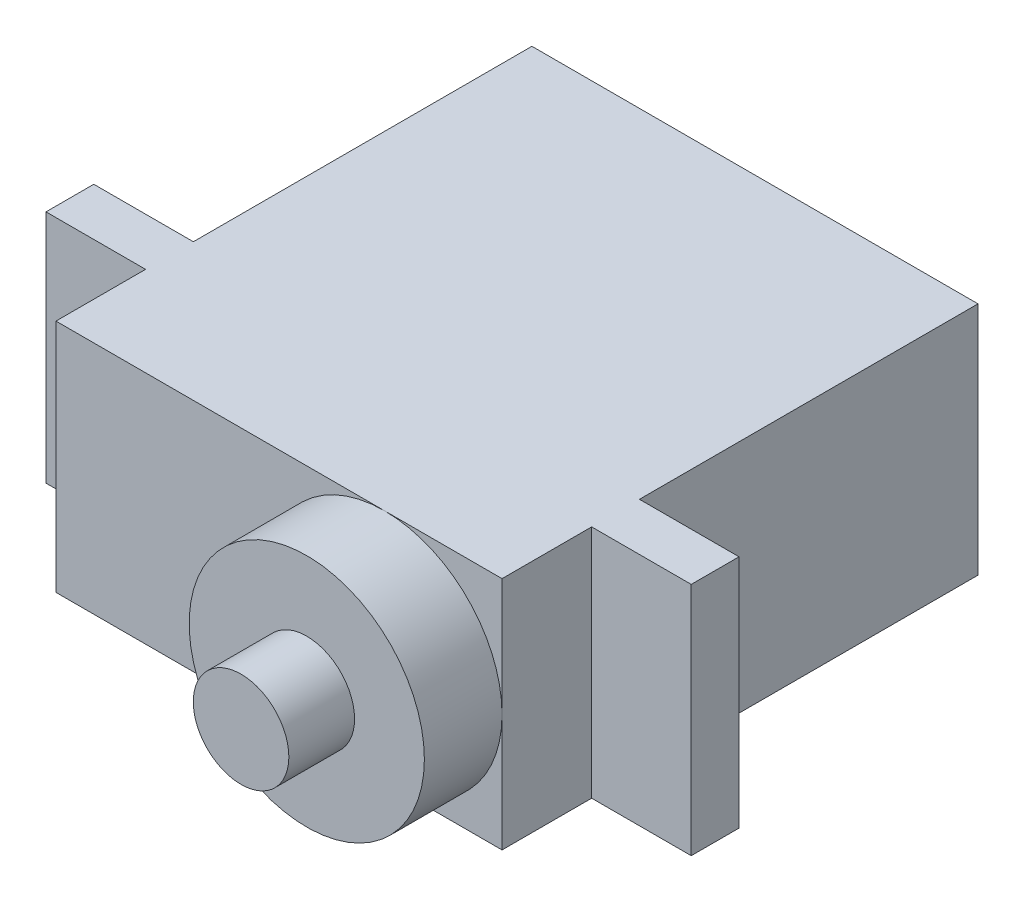
ISO-10303-21;
HEADER;
FILE_DESCRIPTION(('STEP AP214'),'2;1');
FILE_NAME('part.step','',(''),(''),'','','');
FILE_SCHEMA(('AUTOMOTIVE_DESIGN { 1 0 10303 214 1 1 1 1 }'));
ENDSEC;
DATA;
#1=APPLICATION_CONTEXT('core data for automotive mechanical design processes');
#2=APPLICATION_PROTOCOL_DEFINITION('international standard','automotive_design',2000,#1);
#3=PRODUCT_CONTEXT('',#1,'mechanical');
#4=PRODUCT('Part','Part','',(#3));
#5=PRODUCT_RELATED_PRODUCT_CATEGORY('part','',(#4));
#6=PRODUCT_DEFINITION_FORMATION('','',#4);
#7=PRODUCT_DEFINITION_CONTEXT('part definition',#1,'design');
#8=PRODUCT_DEFINITION('design','',#6,#7);
#9=PRODUCT_DEFINITION_SHAPE('','',#8);
#10=(LENGTH_UNIT() NAMED_UNIT(*) SI_UNIT(.MILLI.,.METRE.));
#11=(NAMED_UNIT(*) PLANE_ANGLE_UNIT() SI_UNIT($,.RADIAN.));
#12=(NAMED_UNIT(*) SI_UNIT($,.STERADIAN.) SOLID_ANGLE_UNIT());
#13=UNCERTAINTY_MEASURE_WITH_UNIT(LENGTH_MEASURE(1.E-05),#10,'distance_accuracy_value','');
#14=(GEOMETRIC_REPRESENTATION_CONTEXT(3) GLOBAL_UNCERTAINTY_ASSIGNED_CONTEXT((#13)) GLOBAL_UNIT_ASSIGNED_CONTEXT((#10,
#11,#12)) REPRESENTATION_CONTEXT('',''));
#15=CARTESIAN_POINT('',(0.,0.,0.));
#16=DIRECTION('',(0.,0.,1.));
#17=DIRECTION('',(1.,0.,0.));
#18=AXIS2_PLACEMENT_3D('',#15,#16,#17);
#19=CARTESIAN_POINT('',(0.,0.,0.));
#20=DIRECTION('',(0.,0.,1.));
#21=DIRECTION('',(1.,0.,0.));
#22=AXIS2_PLACEMENT_3D('',#19,#20,#21);
#23=PLANE('',#22);
#24=DIRECTION('',(0.,1.,0.));
#25=VECTOR('',#24,1.);
#26=CARTESIAN_POINT('',(-11.2,5.9,0.));
#27=LINE('',#26,#25);
#28=CARTESIAN_POINT('',(-11.2,-5.9,0.));
#29=VERTEX_POINT('',#28);
#30=CARTESIAN_POINT('',(-11.2,5.9,0.));
#31=VERTEX_POINT('',#30);
#32=EDGE_CURVE('E173',#29,#31,#27,.T.);
#33=ORIENTED_EDGE('',*,*,#32,.F.);
#34=DIRECTION('',(1.,0.,0.));
#35=VECTOR('',#34,1.);
#36=CARTESIAN_POINT('',(16.2,-5.9,0.));
#37=LINE('',#36,#35);
#38=CARTESIAN_POINT('',(-16.2,-5.9,0.));
#39=VERTEX_POINT('',#38);
#40=EDGE_CURVE('E254',#39,#29,#37,.T.);
#41=ORIENTED_EDGE('',*,*,#40,.F.);
#42=DIRECTION('',(0.,-1.,0.));
#43=VECTOR('',#42,1.);
#44=CARTESIAN_POINT('',(-16.2,5.9,0.));
#45=LINE('',#44,#43);
#46=CARTESIAN_POINT('',(-16.2,5.9,0.));
#47=VERTEX_POINT('',#46);
#48=EDGE_CURVE('E264',#47,#39,#45,.T.);
#49=ORIENTED_EDGE('',*,*,#48,.F.);
#50=DIRECTION('',(-1.,0.,0.));
#51=VECTOR('',#50,1.);
#52=CARTESIAN_POINT('',(16.2,5.9,0.));
#53=LINE('',#52,#51);
#54=EDGE_CURVE('E63',#31,#47,#53,.T.);
#55=ORIENTED_EDGE('',*,*,#54,.F.);
#56=EDGE_LOOP('',(#33,#41,#49,#55));
#57=FACE_BOUND('',#56,.T.);
#58=ADVANCED_FACE('F45',(#57),#23,.F.);
#59=DIRECTION('',(0.,-1.,0.));
#60=VECTOR('',#59,1.);
#61=CARTESIAN_POINT('',(11.2,5.9,0.));
#62=LINE('',#61,#60);
#63=CARTESIAN_POINT('',(11.2,5.9,0.));
#64=VERTEX_POINT('',#63);
#65=CARTESIAN_POINT('',(11.2,-5.9,0.));
#66=VERTEX_POINT('',#65);
#67=EDGE_CURVE('E71',#64,#66,#62,.T.);
#68=ORIENTED_EDGE('',*,*,#67,.F.);
#69=CARTESIAN_POINT('',(16.2,5.9,0.));
#70=VERTEX_POINT('',#69);
#71=EDGE_CURVE('E261',#70,#64,#53,.T.);
#72=ORIENTED_EDGE('',*,*,#71,.F.);
#73=DIRECTION('',(0.,1.,0.));
#74=VECTOR('',#73,1.);
#75=CARTESIAN_POINT('',(16.2,5.9,0.));
#76=LINE('',#75,#74);
#77=CARTESIAN_POINT('',(16.2,-5.9,0.));
#78=VERTEX_POINT('',#77);
#79=EDGE_CURVE('E258',#78,#70,#76,.T.);
#80=ORIENTED_EDGE('',*,*,#79,.F.);
#81=EDGE_CURVE('E238',#66,#78,#37,.T.);
#82=ORIENTED_EDGE('',*,*,#81,.F.);
#83=EDGE_LOOP('',(#68,#72,#80,#82));
#84=FACE_BOUND('',#83,.T.);
#85=ADVANCED_FACE('F337',(#84),#23,.F.);
#86=CARTESIAN_POINT('',(0.,0.,6.9));
#87=DIRECTION('',(0.,0.,1.));
#88=DIRECTION('',(1.,0.,0.));
#89=AXIS2_PLACEMENT_3D('',#86,#87,#88);
#90=PLANE('',#89);
#91=CARTESIAN_POINT('',(5.29476675188861,-0.00523556903391821,6.9));
#92=DIRECTION('',(0.,0.,1.));
#93=DIRECTION('',(1.,0.,0.));
#94=AXIS2_PLACEMENT_3D('',#91,#92,#93);
#95=CIRCLE('',#94,5.90523556903392);
#96=CARTESIAN_POINT('',(5.29476675188861,5.9,6.9));
#97=VERTEX_POINT('',#96);
#98=CARTESIAN_POINT('',(4.94325653980303,-5.9,6.9));
#99=VERTEX_POINT('',#98);
#100=EDGE_CURVE('E55',#97,#99,#95,.T.);
#101=ORIENTED_EDGE('',*,*,#100,.F.);
#102=DIRECTION('',(-1.,0.,0.));
#103=VECTOR('',#102,1.);
#104=CARTESIAN_POINT('',(-11.2,5.9,6.9));
#105=LINE('',#104,#103);
#106=CARTESIAN_POINT('',(-11.2,5.9,6.9));
#107=VERTEX_POINT('',#106);
#108=EDGE_CURVE('E211',#97,#107,#105,.T.);
#109=ORIENTED_EDGE('',*,*,#108,.T.);
#110=DIRECTION('',(0.,-1.,0.));
#111=VECTOR('',#110,1.);
#112=CARTESIAN_POINT('',(-11.2,5.9,6.9));
#113=LINE('',#112,#111);
#114=CARTESIAN_POINT('',(-11.2,-5.9,6.9));
#115=VERTEX_POINT('',#114);
#116=EDGE_CURVE('E196',#107,#115,#113,.T.);
#117=ORIENTED_EDGE('',*,*,#116,.T.);
#118=DIRECTION('',(1.,0.,0.));
#119=VECTOR('',#118,1.);
#120=CARTESIAN_POINT('',(-11.2,-5.9,6.9));
#121=LINE('',#120,#119);
#122=EDGE_CURVE('E202',#115,#99,#121,.T.);
#123=ORIENTED_EDGE('',*,*,#122,.T.);
#124=EDGE_LOOP('',(#101,#109,#117,#123));
#125=FACE_BOUND('',#124,.T.);
#126=ADVANCED_FACE('F335',(#125),#90,.T.);
#127=CARTESIAN_POINT('',(11.2000023209225,-0.00523556903391821,6.9));
#128=VERTEX_POINT('',#127);
#129=EDGE_CURVE('E191',#128,#97,#95,.T.);
#130=ORIENTED_EDGE('',*,*,#129,.F.);
#131=DIRECTION('',(0.,1.,0.));
#132=VECTOR('',#131,1.);
#133=CARTESIAN_POINT('',(11.2,5.9,6.9));
#134=LINE('',#133,#132);
#135=CARTESIAN_POINT('',(11.2,5.9,6.9));
#136=VERTEX_POINT('',#135);
#137=EDGE_CURVE('E206',#128,#136,#134,.T.);
#138=ORIENTED_EDGE('',*,*,#137,.T.);
#139=EDGE_CURVE('E212',#136,#97,#105,.T.);
#140=ORIENTED_EDGE('',*,*,#139,.T.);
#141=EDGE_LOOP('',(#130,#138,#140));
#142=FACE_BOUND('',#141,.T.);
#143=ADVANCED_FACE('F312',(#142),#90,.T.);
#144=CARTESIAN_POINT('',(0.,0.,2.4));
#145=DIRECTION('',(0.,0.,1.));
#146=DIRECTION('',(1.,0.,0.));
#147=AXIS2_PLACEMENT_3D('',#144,#145,#146);
#148=PLANE('',#147);
#149=DIRECTION('',(0.,-1.,0.));
#150=VECTOR('',#149,1.);
#151=CARTESIAN_POINT('',(-11.2,5.9,2.4));
#152=LINE('',#151,#150);
#153=CARTESIAN_POINT('',(-11.2,5.9,2.4));
#154=VERTEX_POINT('',#153);
#155=CARTESIAN_POINT('',(-11.2,-5.9,2.4));
#156=VERTEX_POINT('',#155);
#157=EDGE_CURVE('E190',#154,#156,#152,.T.);
#158=ORIENTED_EDGE('',*,*,#157,.F.);
#159=DIRECTION('',(-1.,0.,0.));
#160=VECTOR('',#159,1.);
#161=CARTESIAN_POINT('',(16.2,5.9,2.4));
#162=LINE('',#161,#160);
#163=CARTESIAN_POINT('',(-16.2,5.9,2.4));
#164=VERTEX_POINT('',#163);
#165=EDGE_CURVE('E246',#154,#164,#162,.T.);
#166=ORIENTED_EDGE('',*,*,#165,.T.);
#167=DIRECTION('',(0.,-1.,0.));
#168=VECTOR('',#167,1.);
#169=CARTESIAN_POINT('',(-16.2,5.9,2.4));
#170=LINE('',#169,#168);
#171=CARTESIAN_POINT('',(-16.2,-5.9,2.4));
#172=VERTEX_POINT('',#171);
#173=EDGE_CURVE('E250',#164,#172,#170,.T.);
#174=ORIENTED_EDGE('',*,*,#173,.T.);
#175=DIRECTION('',(1.,0.,0.));
#176=VECTOR('',#175,1.);
#177=CARTESIAN_POINT('',(16.2,-5.9,2.4));
#178=LINE('',#177,#176);
#179=EDGE_CURVE('E239',#172,#156,#178,.T.);
#180=ORIENTED_EDGE('',*,*,#179,.T.);
#181=EDGE_LOOP('',(#158,#166,#174,#180));
#182=FACE_BOUND('',#181,.T.);
#183=ADVANCED_FACE('F325',(#182),#148,.T.);
#184=CARTESIAN_POINT('',(16.2,-5.9,2.4));
#185=DIRECTION('',(0.,1.,0.));
#186=DIRECTION('',(0.,0.,1.));
#187=AXIS2_PLACEMENT_3D('',#184,#185,#186);
#188=PLANE('',#187);
#189=ORIENTED_EDGE('',*,*,#40,.T.);
#190=DIRECTION('',(0.,0.,1.));
#191=VECTOR('',#190,1.);
#192=CARTESIAN_POINT('',(-11.2,-5.9,-17.));
#193=LINE('',#192,#191);
#194=CARTESIAN_POINT('',(-11.2,-5.9,-17.));
#195=VERTEX_POINT('',#194);
#196=EDGE_CURVE('E372',#195,#29,#193,.T.);
#197=ORIENTED_EDGE('',*,*,#196,.F.);
#198=DIRECTION('',(-1.,0.,0.));
#199=VECTOR('',#198,1.);
#200=CARTESIAN_POINT('',(-11.2,-5.9,-17.));
#201=LINE('',#200,#199);
#202=CARTESIAN_POINT('',(11.2,-5.9,-17.));
#203=VERTEX_POINT('',#202);
#204=EDGE_CURVE('E166',#203,#195,#201,.T.);
#205=ORIENTED_EDGE('',*,*,#204,.F.);
#206=DIRECTION('',(0.,0.,1.));
#207=VECTOR('',#206,1.);
#208=CARTESIAN_POINT('',(11.2,-5.9,-17.));
#209=LINE('',#208,#207);
#210=EDGE_CURVE('E182',#203,#66,#209,.T.);
#211=ORIENTED_EDGE('',*,*,#210,.T.);
#212=ORIENTED_EDGE('',*,*,#81,.T.);
#213=DIRECTION('',(0.,0.,-1.));
#214=VECTOR('',#213,1.);
#215=CARTESIAN_POINT('',(16.2,-5.9,2.4));
#216=LINE('',#215,#214);
#217=CARTESIAN_POINT('',(16.2,-5.9,2.4));
#218=VERTEX_POINT('',#217);
#219=EDGE_CURVE('E49',#218,#78,#216,.T.);
#220=ORIENTED_EDGE('',*,*,#219,.F.);
#221=CARTESIAN_POINT('',(11.2,-5.9,2.4));
#222=VERTEX_POINT('',#221);
#223=EDGE_CURVE('E243',#222,#218,#178,.T.);
#224=ORIENTED_EDGE('',*,*,#223,.F.);
#225=DIRECTION('',(0.,0.,-1.));
#226=VECTOR('',#225,1.);
#227=CARTESIAN_POINT('',(11.2,-5.9,6.9));
#228=LINE('',#227,#226);
#229=CARTESIAN_POINT('',(11.2,-5.9,6.9));
#230=VERTEX_POINT('',#229);
#231=EDGE_CURVE('E230',#230,#222,#228,.T.);
#232=ORIENTED_EDGE('',*,*,#231,.F.);
#233=CARTESIAN_POINT('',(5.6462769639742,-5.9,6.9));
#234=VERTEX_POINT('',#233);
#235=EDGE_CURVE('E200',#234,#230,#121,.T.);
#236=ORIENTED_EDGE('',*,*,#235,.F.);
#237=EDGE_CURVE('E207',#99,#234,#121,.T.);
#238=ORIENTED_EDGE('',*,*,#237,.F.);
#239=ORIENTED_EDGE('',*,*,#122,.F.);
#240=DIRECTION('',(0.,0.,-1.));
#241=VECTOR('',#240,1.);
#242=CARTESIAN_POINT('',(-11.2,-5.9,6.9));
#243=LINE('',#242,#241);
#244=EDGE_CURVE('E234',#115,#156,#243,.T.);
#245=ORIENTED_EDGE('',*,*,#244,.T.);
#246=ORIENTED_EDGE('',*,*,#179,.F.);
#247=DIRECTION('',(0.,0.,-1.));
#248=VECTOR('',#247,1.);
#249=CARTESIAN_POINT('',(-16.2,-5.9,2.4));
#250=LINE('',#249,#248);
#251=EDGE_CURVE('E253',#172,#39,#250,.T.);
#252=ORIENTED_EDGE('',*,*,#251,.T.);
#253=EDGE_LOOP('',(#189,#197,#205,#211,#212,#220,#224,#232,#236,#238,#239,#245,#246,#252));
#254=FACE_BOUND('',#253,.T.);
#255=ADVANCED_FACE('F47',(#254),#188,.F.);
#256=CARTESIAN_POINT('',(16.2,5.9,2.4));
#257=DIRECTION('',(-1.,0.,0.));
#258=DIRECTION('',(0.,0.,1.));
#259=AXIS2_PLACEMENT_3D('',#256,#257,#258);
#260=PLANE('',#259);
#261=ORIENTED_EDGE('',*,*,#79,.T.);
#262=DIRECTION('',(0.,0.,-1.));
#263=VECTOR('',#262,1.);
#264=CARTESIAN_POINT('',(16.2,5.9,2.4));
#265=LINE('',#264,#263);
#266=CARTESIAN_POINT('',(16.2,5.9,2.4));
#267=VERTEX_POINT('',#266);
#268=EDGE_CURVE('E273',#267,#70,#265,.T.);
#269=ORIENTED_EDGE('',*,*,#268,.F.);
#270=DIRECTION('',(0.,1.,0.));
#271=VECTOR('',#270,1.);
#272=CARTESIAN_POINT('',(16.2,5.9,2.4));
#273=LINE('',#272,#271);
#274=EDGE_CURVE('E242',#218,#267,#273,.T.);
#275=ORIENTED_EDGE('',*,*,#274,.F.);
#276=ORIENTED_EDGE('',*,*,#219,.T.);
#277=EDGE_LOOP('',(#261,#269,#275,#276));
#278=FACE_BOUND('',#277,.T.);
#279=ADVANCED_FACE('F359',(#278),#260,.F.);
#280=CARTESIAN_POINT('',(16.2,5.9,2.4));
#281=DIRECTION('',(0.,-1.,0.));
#282=DIRECTION('',(0.,0.,-1.));
#283=AXIS2_PLACEMENT_3D('',#280,#281,#282);
#284=PLANE('',#283);
#285=ORIENTED_EDGE('',*,*,#71,.T.);
#286=DIRECTION('',(0.,0.,1.));
#287=VECTOR('',#286,1.);
#288=CARTESIAN_POINT('',(11.2,5.9,-17.));
#289=LINE('',#288,#287);
#290=CARTESIAN_POINT('',(11.2,5.9,-17.));
#291=VERTEX_POINT('',#290);
#292=EDGE_CURVE('E156',#291,#64,#289,.T.);
#293=ORIENTED_EDGE('',*,*,#292,.F.);
#294=DIRECTION('',(1.,0.,0.));
#295=VECTOR('',#294,1.);
#296=CARTESIAN_POINT('',(-11.2,5.9,-17.));
#297=LINE('',#296,#295);
#298=CARTESIAN_POINT('',(-11.2,5.9,-17.));
#299=VERTEX_POINT('',#298);
#300=EDGE_CURVE('E149',#299,#291,#297,.T.);
#301=ORIENTED_EDGE('',*,*,#300,.F.);
#302=DIRECTION('',(0.,0.,1.));
#303=VECTOR('',#302,1.);
#304=CARTESIAN_POINT('',(-11.2,5.9,-17.));
#305=LINE('',#304,#303);
#306=EDGE_CURVE('E153',#299,#31,#305,.T.);
#307=ORIENTED_EDGE('',*,*,#306,.T.);
#308=ORIENTED_EDGE('',*,*,#54,.T.);
#309=DIRECTION('',(0.,0.,-1.));
#310=VECTOR('',#309,1.);
#311=CARTESIAN_POINT('',(-16.2,5.9,2.4));
#312=LINE('',#311,#310);
#313=EDGE_CURVE('E270',#164,#47,#312,.T.);
#314=ORIENTED_EDGE('',*,*,#313,.F.);
#315=ORIENTED_EDGE('',*,*,#165,.F.);
#316=DIRECTION('',(0.,0.,-1.));
#317=VECTOR('',#316,1.);
#318=CARTESIAN_POINT('',(-11.2,5.9,6.9));
#319=LINE('',#318,#317);
#320=EDGE_CURVE('E216',#107,#154,#319,.T.);
#321=ORIENTED_EDGE('',*,*,#320,.F.);
#322=ORIENTED_EDGE('',*,*,#108,.F.);
#323=ORIENTED_EDGE('',*,*,#139,.F.);
#324=DIRECTION('',(0.,0.,-1.));
#325=VECTOR('',#324,1.);
#326=CARTESIAN_POINT('',(11.2,5.9,6.9));
#327=LINE('',#326,#325);
#328=CARTESIAN_POINT('',(11.2,5.9,2.4));
#329=VERTEX_POINT('',#328);
#330=EDGE_CURVE('E226',#136,#329,#327,.T.);
#331=ORIENTED_EDGE('',*,*,#330,.T.);
#332=EDGE_CURVE('E247',#267,#329,#162,.T.);
#333=ORIENTED_EDGE('',*,*,#332,.F.);
#334=ORIENTED_EDGE('',*,*,#268,.T.);
#335=EDGE_LOOP('',(#285,#293,#301,#307,#308,#314,#315,#321,#322,#323,#331,#333,#334));
#336=FACE_BOUND('',#335,.T.);
#337=ADVANCED_FACE('F151',(#336),#284,.F.);
#338=CARTESIAN_POINT('',(-16.2,5.9,2.4));
#339=DIRECTION('',(1.,0.,0.));
#340=DIRECTION('',(0.,1.,0.));
#341=AXIS2_PLACEMENT_3D('',#338,#339,#340);
#342=PLANE('',#341);
#343=ORIENTED_EDGE('',*,*,#48,.T.);
#344=ORIENTED_EDGE('',*,*,#251,.F.);
#345=ORIENTED_EDGE('',*,*,#173,.F.);
#346=ORIENTED_EDGE('',*,*,#313,.T.);
#347=EDGE_LOOP('',(#343,#344,#345,#346));
#348=FACE_BOUND('',#347,.T.);
#349=ADVANCED_FACE('F329',(#348),#342,.F.);
#350=DIRECTION('',(0.,1.,0.));
#351=VECTOR('',#350,1.);
#352=CARTESIAN_POINT('',(11.2,5.9,2.4));
#353=LINE('',#352,#351);
#354=EDGE_CURVE('E201',#222,#329,#353,.T.);
#355=ORIENTED_EDGE('',*,*,#354,.F.);
#356=ORIENTED_EDGE('',*,*,#223,.T.);
#357=ORIENTED_EDGE('',*,*,#274,.T.);
#358=ORIENTED_EDGE('',*,*,#332,.T.);
#359=EDGE_LOOP('',(#355,#356,#357,#358));
#360=FACE_BOUND('',#359,.T.);
#361=ADVANCED_FACE('F354',(#360),#148,.T.);
#362=CARTESIAN_POINT('',(-11.2,5.9,6.9));
#363=DIRECTION('',(1.,0.,0.));
#364=DIRECTION('',(0.,0.,-1.));
#365=AXIS2_PLACEMENT_3D('',#362,#363,#364);
#366=PLANE('',#365);
#367=ORIENTED_EDGE('',*,*,#157,.T.);
#368=ORIENTED_EDGE('',*,*,#244,.F.);
#369=ORIENTED_EDGE('',*,*,#116,.F.);
#370=ORIENTED_EDGE('',*,*,#320,.T.);
#371=EDGE_LOOP('',(#367,#368,#369,#370));
#372=FACE_BOUND('',#371,.T.);
#373=ADVANCED_FACE('F334',(#372),#366,.F.);
#374=CARTESIAN_POINT('',(11.2,5.9,6.9));
#375=DIRECTION('',(-1.,0.,0.));
#376=DIRECTION('',(0.,0.,1.));
#377=AXIS2_PLACEMENT_3D('',#374,#375,#376);
#378=PLANE('',#377);
#379=ORIENTED_EDGE('',*,*,#354,.T.);
#380=ORIENTED_EDGE('',*,*,#330,.F.);
#381=ORIENTED_EDGE('',*,*,#137,.F.);
#382=EDGE_CURVE('E208',#230,#128,#134,.T.);
#383=ORIENTED_EDGE('',*,*,#382,.F.);
#384=ORIENTED_EDGE('',*,*,#231,.T.);
#385=EDGE_LOOP('',(#379,#380,#381,#383,#384));
#386=FACE_BOUND('',#385,.T.);
#387=ADVANCED_FACE('F306',(#386),#378,.F.);
#388=EDGE_CURVE('E195',#234,#128,#95,.T.);
#389=ORIENTED_EDGE('',*,*,#388,.F.);
#390=ORIENTED_EDGE('',*,*,#235,.T.);
#391=ORIENTED_EDGE('',*,*,#382,.T.);
#392=EDGE_LOOP('',(#389,#390,#391));
#393=FACE_BOUND('',#392,.T.);
#394=ADVANCED_FACE('F301',(#393),#90,.T.);
#395=CARTESIAN_POINT('',(5.29476675188861,-0.00523556903391821,6.9));
#396=DIRECTION('',(0.,0.,1.));
#397=DIRECTION('',(1.,0.,0.));
#398=AXIS2_PLACEMENT_3D('',#395,#396,#397);
#399=PLANE('',#398);
#400=EDGE_CURVE('E180',#99,#234,#95,.T.);
#401=ORIENTED_EDGE('',*,*,#400,.F.);
#402=ORIENTED_EDGE('',*,*,#237,.T.);
#403=EDGE_LOOP('',(#401,#402));
#404=FACE_BOUND('',#403,.T.);
#405=ADVANCED_FACE('F294',(#404),#399,.F.);
#406=CARTESIAN_POINT('',(5.29476675188861,-0.00523556903391821,10.8));
#407=DIRECTION('',(0.,0.,-1.));
#408=DIRECTION('',(-1.,0.,0.));
#409=AXIS2_PLACEMENT_3D('',#406,#407,#408);
#410=CYLINDRICAL_SURFACE('',#409,5.90523556903392);
#411=CARTESIAN_POINT('',(5.29476675188861,-0.00523556903391821,10.8));
#412=DIRECTION('',(0.,0.,1.));
#413=DIRECTION('',(1.,0.,0.));
#414=AXIS2_PLACEMENT_3D('',#411,#412,#413);
#415=CIRCLE('',#414,5.90523556903392);
#416=CARTESIAN_POINT('',(11.2000023209225,-0.00523556903391821,10.8));
#417=VERTEX_POINT('',#416);
#418=EDGE_CURVE('E186',#417,#417,#415,.T.);
#419=ORIENTED_EDGE('',*,*,#418,.F.);
#420=EDGE_LOOP('',(#419));
#421=FACE_BOUND('',#420,.T.);
#422=ORIENTED_EDGE('',*,*,#129,.T.);
#423=ORIENTED_EDGE('',*,*,#100,.T.);
#424=ORIENTED_EDGE('',*,*,#400,.T.);
#425=ORIENTED_EDGE('',*,*,#388,.T.);
#426=EDGE_LOOP('',(#422,#423,#424,#425));
#427=FACE_BOUND('',#426,.T.);
#428=ADVANCED_FACE('F291',(#421,#427),#410,.T.);
#429=CARTESIAN_POINT('',(5.29476675188861,-0.00523556903391821,10.8));
#430=DIRECTION('',(0.,0.,1.));
#431=DIRECTION('',(1.,0.,0.));
#432=AXIS2_PLACEMENT_3D('',#429,#430,#431);
#433=PLANE('',#432);
#434=CARTESIAN_POINT('',(5.29476675188861,-0.00523556903391821,10.8));
#435=DIRECTION('',(0.,0.,1.));
#436=DIRECTION('',(1.,0.,0.));
#437=AXIS2_PLACEMENT_3D('',#434,#435,#436);
#438=CIRCLE('',#437,2.4);
#439=CARTESIAN_POINT('',(7.69476675188861,-0.00523556903391821,10.8));
#440=VERTEX_POINT('',#439);
#441=EDGE_CURVE('E11',#440,#440,#438,.T.);
#442=ORIENTED_EDGE('',*,*,#441,.F.);
#443=EDGE_LOOP('',(#442));
#444=FACE_BOUND('',#443,.T.);
#445=ORIENTED_EDGE('',*,*,#418,.T.);
#446=EDGE_LOOP('',(#445));
#447=FACE_BOUND('',#446,.T.);
#448=ADVANCED_FACE('F396',(#444,#447),#433,.T.);
#449=CARTESIAN_POINT('',(5.29476675188861,-0.00523556903391821,14.1));
#450=DIRECTION('',(0.,0.,-1.));
#451=DIRECTION('',(-1.,0.,0.));
#452=AXIS2_PLACEMENT_3D('',#449,#450,#451);
#453=CYLINDRICAL_SURFACE('',#452,2.4);
#454=CARTESIAN_POINT('',(5.29476675188861,-0.00523556903391821,14.1));
#455=DIRECTION('',(0.,0.,1.));
#456=DIRECTION('',(1.,0.,0.));
#457=AXIS2_PLACEMENT_3D('',#454,#455,#456);
#458=CIRCLE('',#457,2.4);
#459=CARTESIAN_POINT('',(7.69476675188861,-0.00523556903391821,14.1));
#460=VERTEX_POINT('',#459);
#461=EDGE_CURVE('E175',#460,#460,#458,.T.);
#462=ORIENTED_EDGE('',*,*,#461,.F.);
#463=EDGE_LOOP('',(#462));
#464=FACE_BOUND('',#463,.T.);
#465=ORIENTED_EDGE('',*,*,#441,.T.);
#466=EDGE_LOOP('',(#465));
#467=FACE_BOUND('',#466,.T.);
#468=ADVANCED_FACE('F392',(#464,#467),#453,.T.);
#469=CARTESIAN_POINT('',(5.29476675188861,-0.00523556903391821,14.1));
#470=DIRECTION('',(0.,0.,1.));
#471=DIRECTION('',(1.,0.,0.));
#472=AXIS2_PLACEMENT_3D('',#469,#470,#471);
#473=PLANE('',#472);
#474=ORIENTED_EDGE('',*,*,#461,.T.);
#475=EDGE_LOOP('',(#474));
#476=FACE_BOUND('',#475,.T.);
#477=ADVANCED_FACE('F388',(#476),#473,.T.);
#478=CARTESIAN_POINT('',(-11.2,5.9,-17.));
#479=DIRECTION('',(1.,0.,0.));
#480=DIRECTION('',(0.,0.,-1.));
#481=AXIS2_PLACEMENT_3D('',#478,#479,#480);
#482=PLANE('',#481);
#483=ORIENTED_EDGE('',*,*,#32,.T.);
#484=ORIENTED_EDGE('',*,*,#306,.F.);
#485=DIRECTION('',(0.,1.,0.));
#486=VECTOR('',#485,1.);
#487=CARTESIAN_POINT('',(-11.2,5.9,-17.));
#488=LINE('',#487,#486);
#489=EDGE_CURVE('E161',#195,#299,#488,.T.);
#490=ORIENTED_EDGE('',*,*,#489,.F.);
#491=ORIENTED_EDGE('',*,*,#196,.T.);
#492=EDGE_LOOP('',(#483,#484,#490,#491));
#493=FACE_BOUND('',#492,.T.);
#494=ADVANCED_FACE('F172',(#493),#482,.F.);
#495=CARTESIAN_POINT('',(11.2,5.9,-17.));
#496=DIRECTION('',(-1.,0.,0.));
#497=DIRECTION('',(0.,0.,1.));
#498=AXIS2_PLACEMENT_3D('',#495,#496,#497);
#499=PLANE('',#498);
#500=ORIENTED_EDGE('',*,*,#67,.T.);
#501=ORIENTED_EDGE('',*,*,#210,.F.);
#502=DIRECTION('',(0.,-1.,0.));
#503=VECTOR('',#502,1.);
#504=CARTESIAN_POINT('',(11.2,5.9,-17.));
#505=LINE('',#504,#503);
#506=EDGE_CURVE('E160',#291,#203,#505,.T.);
#507=ORIENTED_EDGE('',*,*,#506,.F.);
#508=ORIENTED_EDGE('',*,*,#292,.T.);
#509=EDGE_LOOP('',(#500,#501,#507,#508));
#510=FACE_BOUND('',#509,.T.);
#511=ADVANCED_FACE('F366',(#510),#499,.F.);
#512=CARTESIAN_POINT('',(0.,0.,-17.));
#513=DIRECTION('',(0.,0.,1.));
#514=DIRECTION('',(1.,0.,0.));
#515=AXIS2_PLACEMENT_3D('',#512,#513,#514);
#516=PLANE('',#515);
#517=ORIENTED_EDGE('',*,*,#489,.T.);
#518=ORIENTED_EDGE('',*,*,#300,.T.);
#519=ORIENTED_EDGE('',*,*,#506,.T.);
#520=ORIENTED_EDGE('',*,*,#204,.T.);
#521=EDGE_LOOP('',(#517,#518,#519,#520));
#522=FACE_BOUND('',#521,.T.);
#523=ADVANCED_FACE('F164',(#522),#516,.F.);
#524=CLOSED_SHELL('',(#58,#85,#126,#143,#183,#255,#279,#337,#349,#361,#373,#387,#394,#405,#428,
#448,#468,#477,#494,#511,#523));
#525=MANIFOLD_SOLID_BREP('B2',#524);
#526=ADVANCED_BREP_SHAPE_REPRESENTATION('',(#18,#525),#14);
#527=SHAPE_DEFINITION_REPRESENTATION(#9,#526);
ENDSEC;
END-ISO-10303-21;
